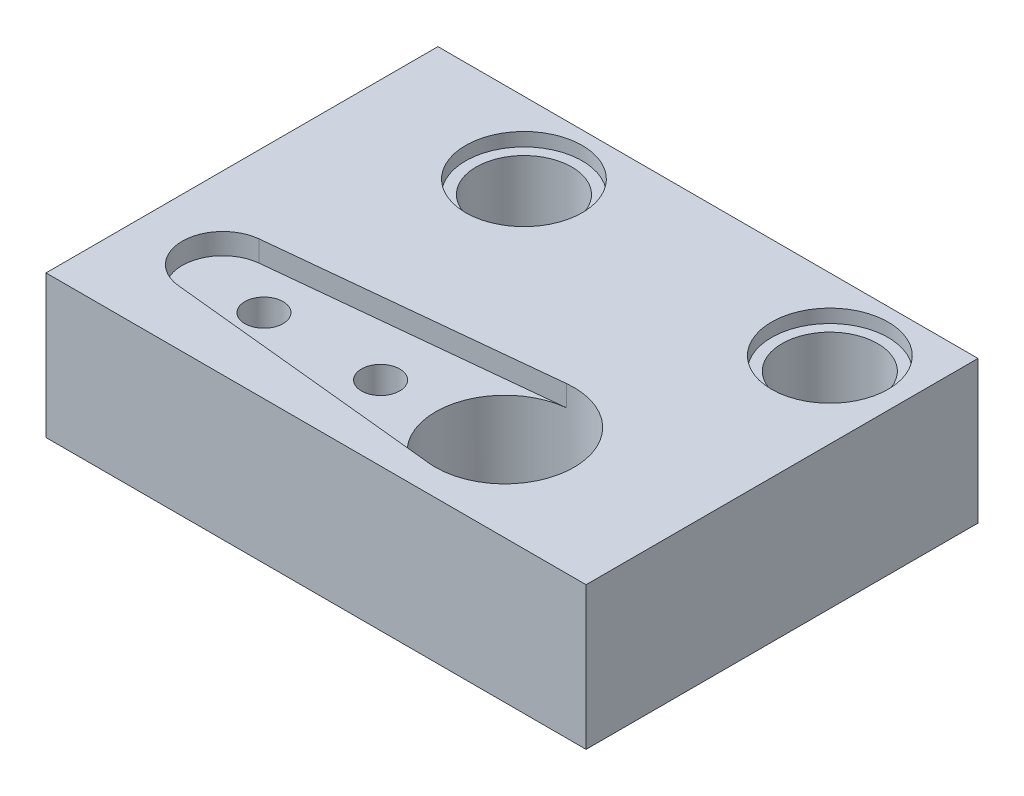
ISO-10303-21;
HEADER;
FILE_DESCRIPTION(('STEP AP214'),'2;1');
FILE_NAME('part.step','',(''),(''),'','','');
FILE_SCHEMA(('AUTOMOTIVE_DESIGN { 1 0 10303 214 1 1 1 1 }'));
ENDSEC;
DATA;
#1=APPLICATION_CONTEXT('core data for automotive mechanical design processes');
#2=APPLICATION_PROTOCOL_DEFINITION('international standard','automotive_design',2000,#1);
#3=PRODUCT_CONTEXT('',#1,'mechanical');
#4=PRODUCT('Part','Part','',(#3));
#5=PRODUCT_RELATED_PRODUCT_CATEGORY('part','',(#4));
#6=PRODUCT_DEFINITION_FORMATION('','',#4);
#7=PRODUCT_DEFINITION_CONTEXT('part definition',#1,'design');
#8=PRODUCT_DEFINITION('design','',#6,#7);
#9=PRODUCT_DEFINITION_SHAPE('','',#8);
#10=(LENGTH_UNIT() NAMED_UNIT(*) SI_UNIT(.MILLI.,.METRE.));
#11=(NAMED_UNIT(*) PLANE_ANGLE_UNIT() SI_UNIT($,.RADIAN.));
#12=(NAMED_UNIT(*) SI_UNIT($,.STERADIAN.) SOLID_ANGLE_UNIT());
#13=UNCERTAINTY_MEASURE_WITH_UNIT(LENGTH_MEASURE(1.E-05),#10,'distance_accuracy_value','');
#14=(GEOMETRIC_REPRESENTATION_CONTEXT(3) GLOBAL_UNCERTAINTY_ASSIGNED_CONTEXT((#13)) GLOBAL_UNIT_ASSIGNED_CONTEXT((#10,
#11,#12)) REPRESENTATION_CONTEXT('',''));
#15=CARTESIAN_POINT('',(0.,0.,0.));
#16=DIRECTION('',(0.,0.,1.));
#17=DIRECTION('',(1.,0.,0.));
#18=AXIS2_PLACEMENT_3D('',#15,#16,#17);
#19=CARTESIAN_POINT('',(-10.75,7.46,-11.75));
#20=DIRECTION('',(0.,-1.,0.));
#21=DIRECTION('',(0.,0.,-1.));
#22=AXIS2_PLACEMENT_3D('',#19,#20,#21);
#23=CYLINDRICAL_SURFACE('',#22,2.5);
#24=CARTESIAN_POINT('',(-10.75,6.76,-11.75));
#25=DIRECTION('',(0.,1.,0.));
#26=DIRECTION('',(0.,0.,1.));
#27=AXIS2_PLACEMENT_3D('',#24,#25,#26);
#28=CIRCLE('',#27,2.5);
#29=CARTESIAN_POINT('',(-10.75,6.76,-14.25));
#30=VERTEX_POINT('',#29);
#31=EDGE_CURVE('E120',#30,#30,#28,.T.);
#32=CARTESIAN_POINT('',(-10.75,0.7,-11.75));
#33=DIRECTION('',(0.,-1.,0.));
#34=DIRECTION('',(0.,0.,-1.));
#35=AXIS2_PLACEMENT_3D('',#32,#33,#34);
#36=CIRCLE('',#35,2.5);
#37=CARTESIAN_POINT('',(-10.75,0.7,-14.25));
#38=VERTEX_POINT('',#37);
#39=EDGE_CURVE('E36',#38,#38,#36,.T.);
#40=CARTESIAN_POINT('',(-10.75,6.76,-14.25));
#41=CARTESIAN_POINT('',(-10.75,6.696875,-14.25));
#42=CARTESIAN_POINT('',(-10.75,6.63375,-14.25));
#43=CARTESIAN_POINT('',(-10.75,6.5075,-14.25));
#44=CARTESIAN_POINT('',(-10.75,6.444375,-14.25));
#45=CARTESIAN_POINT('',(-10.75,6.318125,-14.25));
#46=CARTESIAN_POINT('',(-10.75,6.255,-14.25));
#47=CARTESIAN_POINT('',(-10.75,6.12875,-14.25));
#48=CARTESIAN_POINT('',(-10.75,6.065625,-14.25));
#49=CARTESIAN_POINT('',(-10.75,5.939375,-14.25));
#50=CARTESIAN_POINT('',(-10.75,5.87625,-14.25));
#51=CARTESIAN_POINT('',(-10.75,5.75,-14.25));
#52=CARTESIAN_POINT('',(-10.75,5.686875,-14.25));
#53=CARTESIAN_POINT('',(-10.75,5.560625,-14.25));
#54=CARTESIAN_POINT('',(-10.75,5.4975,-14.25));
#55=CARTESIAN_POINT('',(-10.75,5.37125,-14.25));
#56=CARTESIAN_POINT('',(-10.75,5.308125,-14.25));
#57=CARTESIAN_POINT('',(-10.75,5.181875,-14.25));
#58=CARTESIAN_POINT('',(-10.75,5.11875,-14.25));
#59=CARTESIAN_POINT('',(-10.75,4.9925,-14.25));
#60=CARTESIAN_POINT('',(-10.75,4.929375,-14.25));
#61=CARTESIAN_POINT('',(-10.75,4.803125,-14.25));
#62=CARTESIAN_POINT('',(-10.75,4.74,-14.25));
#63=CARTESIAN_POINT('',(-10.75,4.61375,-14.25));
#64=CARTESIAN_POINT('',(-10.75,4.550625,-14.25));
#65=CARTESIAN_POINT('',(-10.75,4.424375,-14.25));
#66=CARTESIAN_POINT('',(-10.75,4.36125,-14.25));
#67=CARTESIAN_POINT('',(-10.75,4.235,-14.25));
#68=CARTESIAN_POINT('',(-10.75,4.171875,-14.25));
#69=CARTESIAN_POINT('',(-10.75,4.045625,-14.25));
#70=CARTESIAN_POINT('',(-10.75,3.9825,-14.25));
#71=CARTESIAN_POINT('',(-10.75,3.85625,-14.25));
#72=CARTESIAN_POINT('',(-10.75,3.793125,-14.25));
#73=CARTESIAN_POINT('',(-10.75,3.666875,-14.25));
#74=CARTESIAN_POINT('',(-10.75,3.60375,-14.25));
#75=CARTESIAN_POINT('',(-10.75,3.4775,-14.25));
#76=CARTESIAN_POINT('',(-10.75,3.414375,-14.25));
#77=CARTESIAN_POINT('',(-10.75,3.288125,-14.25));
#78=CARTESIAN_POINT('',(-10.75,3.225,-14.25));
#79=CARTESIAN_POINT('',(-10.75,3.09875,-14.25));
#80=CARTESIAN_POINT('',(-10.75,3.035625,-14.25));
#81=CARTESIAN_POINT('',(-10.75,2.909375,-14.25));
#82=CARTESIAN_POINT('',(-10.75,2.84625,-14.25));
#83=CARTESIAN_POINT('',(-10.75,2.72,-14.25));
#84=CARTESIAN_POINT('',(-10.75,2.656875,-14.25));
#85=CARTESIAN_POINT('',(-10.75,2.530625,-14.25));
#86=CARTESIAN_POINT('',(-10.75,2.4675,-14.25));
#87=CARTESIAN_POINT('',(-10.75,2.34125,-14.25));
#88=CARTESIAN_POINT('',(-10.75,2.278125,-14.25));
#89=CARTESIAN_POINT('',(-10.75,2.151875,-14.25));
#90=CARTESIAN_POINT('',(-10.75,2.08875,-14.25));
#91=CARTESIAN_POINT('',(-10.75,1.9625,-14.25));
#92=CARTESIAN_POINT('',(-10.75,1.899375,-14.25));
#93=CARTESIAN_POINT('',(-10.75,1.773125,-14.25));
#94=CARTESIAN_POINT('',(-10.75,1.71,-14.25));
#95=CARTESIAN_POINT('',(-10.75,1.58375,-14.25));
#96=CARTESIAN_POINT('',(-10.75,1.520625,-14.25));
#97=CARTESIAN_POINT('',(-10.75,1.394375,-14.25));
#98=CARTESIAN_POINT('',(-10.75,1.33125,-14.25));
#99=CARTESIAN_POINT('',(-10.75,1.205,-14.25));
#100=CARTESIAN_POINT('',(-10.75,1.141875,-14.25));
#101=CARTESIAN_POINT('',(-10.75,1.015625,-14.25));
#102=CARTESIAN_POINT('',(-10.75,0.952500000000001,-14.25));
#103=CARTESIAN_POINT('',(-10.75,0.82625,-14.25));
#104=CARTESIAN_POINT('',(-10.75,0.763125,-14.25));
#105=CARTESIAN_POINT('',(-10.75,0.7,-14.25));
#106=B_SPLINE_CURVE_WITH_KNOTS('',3,(#40,#41,#42,#43,#44,#45,#46,#47,#48,#49,#50,#51,#52,#53,
#54,#55,#56,#57,#58,#59,#60,#61,#62,#63,#64,#65,#66,#67,#68,#69,#70,#71,#72,#73,#74,#75,#76,#77,
#78,#79,#80,#81,#82,#83,#84,#85,#86,#87,#88,#89,#90,#91,#92,#93,#94,#95,#96,#97,#98,#99,#100,
#101,#102,#103,#104,#105),.UNSPECIFIED.,.F.,.F.,(4,2,2,2,2,2,2,2,2,2,2,2,2,2,2,2,2,2,2,2,2,2,2,
2,2,2,2,2,2,2,2,2,4),(0.,0.189375,0.37875,0.568125,0.7575,0.946875,1.13625,1.325625,1.515,
1.704375,1.89375,2.083125,2.2725,2.461875,2.65125,2.840625,3.03,3.219375,3.40875,3.598125,
3.7875,3.976875,4.16625,4.355625,4.545,4.734375,4.92375,5.113125,5.3025,5.491875,5.68125,
5.870625,6.06),.UNSPECIFIED.);
#107=EDGE_CURVE('BSEAM32',#30,#38,#106,.T.);
#108=ORIENTED_EDGE('',*,*,#31,.T.);
#109=ORIENTED_EDGE('',*,*,#39,.T.);
#110=ORIENTED_EDGE('',*,*,#107,.T.);
#111=ORIENTED_EDGE('',*,*,#107,.F.);
#112=EDGE_LOOP('',(#108,#110,#109,#111));
#113=FACE_BOUND('',#112,.T.);
#114=ADVANCED_FACE('F32',(#113),#23,.F.);
#115=CARTESIAN_POINT('',(5.25,7.46,-11.75));
#116=DIRECTION('',(0.,-1.,0.));
#117=DIRECTION('',(0.,0.,-1.));
#118=AXIS2_PLACEMENT_3D('',#115,#116,#117);
#119=CYLINDRICAL_SURFACE('',#118,2.5);
#120=CARTESIAN_POINT('',(5.25,6.76,-11.75));
#121=DIRECTION('',(0.,1.,0.));
#122=DIRECTION('',(0.,0.,1.));
#123=AXIS2_PLACEMENT_3D('',#120,#121,#122);
#124=CIRCLE('',#123,2.5);
#125=CARTESIAN_POINT('',(5.25,6.76,-14.25));
#126=VERTEX_POINT('',#125);
#127=EDGE_CURVE('E176',#126,#126,#124,.T.);
#128=CARTESIAN_POINT('',(5.25,0.7,-11.75));
#129=DIRECTION('',(0.,-1.,0.));
#130=DIRECTION('',(0.,0.,-1.));
#131=AXIS2_PLACEMENT_3D('',#128,#129,#130);
#132=CIRCLE('',#131,2.5);
#133=CARTESIAN_POINT('',(5.25,0.7,-14.25));
#134=VERTEX_POINT('',#133);
#135=EDGE_CURVE('E180',#134,#134,#132,.T.);
#136=CARTESIAN_POINT('',(5.25,6.76,-14.25));
#137=CARTESIAN_POINT('',(5.25,6.696875,-14.25));
#138=CARTESIAN_POINT('',(5.25,6.63375,-14.25));
#139=CARTESIAN_POINT('',(5.25,6.5075,-14.25));
#140=CARTESIAN_POINT('',(5.25,6.444375,-14.25));
#141=CARTESIAN_POINT('',(5.25,6.318125,-14.25));
#142=CARTESIAN_POINT('',(5.25,6.255,-14.25));
#143=CARTESIAN_POINT('',(5.25,6.12875,-14.25));
#144=CARTESIAN_POINT('',(5.25,6.065625,-14.25));
#145=CARTESIAN_POINT('',(5.25,5.939375,-14.25));
#146=CARTESIAN_POINT('',(5.25,5.87625,-14.25));
#147=CARTESIAN_POINT('',(5.25,5.75,-14.25));
#148=CARTESIAN_POINT('',(5.25,5.686875,-14.25));
#149=CARTESIAN_POINT('',(5.25,5.560625,-14.25));
#150=CARTESIAN_POINT('',(5.25,5.4975,-14.25));
#151=CARTESIAN_POINT('',(5.25,5.37125,-14.25));
#152=CARTESIAN_POINT('',(5.25,5.308125,-14.25));
#153=CARTESIAN_POINT('',(5.25,5.181875,-14.25));
#154=CARTESIAN_POINT('',(5.25,5.11875,-14.25));
#155=CARTESIAN_POINT('',(5.25,4.9925,-14.25));
#156=CARTESIAN_POINT('',(5.25,4.929375,-14.25));
#157=CARTESIAN_POINT('',(5.25,4.803125,-14.25));
#158=CARTESIAN_POINT('',(5.25,4.74,-14.25));
#159=CARTESIAN_POINT('',(5.25,4.61375,-14.25));
#160=CARTESIAN_POINT('',(5.25,4.550625,-14.25));
#161=CARTESIAN_POINT('',(5.25,4.424375,-14.25));
#162=CARTESIAN_POINT('',(5.25,4.36125,-14.25));
#163=CARTESIAN_POINT('',(5.25,4.235,-14.25));
#164=CARTESIAN_POINT('',(5.25,4.171875,-14.25));
#165=CARTESIAN_POINT('',(5.25,4.045625,-14.25));
#166=CARTESIAN_POINT('',(5.25,3.9825,-14.25));
#167=CARTESIAN_POINT('',(5.25,3.85625,-14.25));
#168=CARTESIAN_POINT('',(5.25,3.793125,-14.25));
#169=CARTESIAN_POINT('',(5.25,3.666875,-14.25));
#170=CARTESIAN_POINT('',(5.25,3.60375,-14.25));
#171=CARTESIAN_POINT('',(5.25,3.4775,-14.25));
#172=CARTESIAN_POINT('',(5.25,3.414375,-14.25));
#173=CARTESIAN_POINT('',(5.25,3.288125,-14.25));
#174=CARTESIAN_POINT('',(5.25,3.225,-14.25));
#175=CARTESIAN_POINT('',(5.25,3.09875,-14.25));
#176=CARTESIAN_POINT('',(5.25,3.035625,-14.25));
#177=CARTESIAN_POINT('',(5.25,2.909375,-14.25));
#178=CARTESIAN_POINT('',(5.25,2.84625,-14.25));
#179=CARTESIAN_POINT('',(5.25,2.72,-14.25));
#180=CARTESIAN_POINT('',(5.25,2.656875,-14.25));
#181=CARTESIAN_POINT('',(5.25,2.530625,-14.25));
#182=CARTESIAN_POINT('',(5.25,2.4675,-14.25));
#183=CARTESIAN_POINT('',(5.25,2.34125,-14.25));
#184=CARTESIAN_POINT('',(5.25,2.278125,-14.25));
#185=CARTESIAN_POINT('',(5.25,2.151875,-14.25));
#186=CARTESIAN_POINT('',(5.25,2.08875,-14.25));
#187=CARTESIAN_POINT('',(5.25,1.9625,-14.25));
#188=CARTESIAN_POINT('',(5.25,1.899375,-14.25));
#189=CARTESIAN_POINT('',(5.25,1.773125,-14.25));
#190=CARTESIAN_POINT('',(5.25,1.71,-14.25));
#191=CARTESIAN_POINT('',(5.25,1.58375,-14.25));
#192=CARTESIAN_POINT('',(5.25,1.520625,-14.25));
#193=CARTESIAN_POINT('',(5.25,1.394375,-14.25));
#194=CARTESIAN_POINT('',(5.25,1.33125,-14.25));
#195=CARTESIAN_POINT('',(5.25,1.205,-14.25));
#196=CARTESIAN_POINT('',(5.25,1.141875,-14.25));
#197=CARTESIAN_POINT('',(5.25,1.015625,-14.25));
#198=CARTESIAN_POINT('',(5.25,0.952500000000001,-14.25));
#199=CARTESIAN_POINT('',(5.25,0.82625,-14.25));
#200=CARTESIAN_POINT('',(5.25,0.763125,-14.25));
#201=CARTESIAN_POINT('',(5.25,0.7,-14.25));
#202=B_SPLINE_CURVE_WITH_KNOTS('',3,(#136,#137,#138,#139,#140,#141,#142,#143,#144,#145,#146,
#147,#148,#149,#150,#151,#152,#153,#154,#155,#156,#157,#158,#159,#160,#161,#162,#163,#164,#165,
#166,#167,#168,#169,#170,#171,#172,#173,#174,#175,#176,#177,#178,#179,#180,#181,#182,#183,#184,
#185,#186,#187,#188,#189,#190,#191,#192,#193,#194,#195,#196,#197,#198,#199,#200,#201),
.UNSPECIFIED.,.F.,.F.,(4,2,2,2,2,2,2,2,2,2,2,2,2,2,2,2,2,2,2,2,2,2,2,2,2,2,2,2,2,2,2,2,4),(0.,
0.189375,0.37875,0.568125,0.7575,0.946875,1.13625,1.325625,1.515,1.704375,1.89375,2.083125,
2.2725,2.461875,2.65125,2.840625,3.03,3.219375,3.40875,3.598125,3.7875,3.976875,4.16625,
4.355625,4.545,4.734375,4.92375,5.113125,5.3025,5.491875,5.68125,5.870625,6.06),.UNSPECIFIED.);
#203=EDGE_CURVE('BSEAM225',#126,#134,#202,.T.);
#204=ORIENTED_EDGE('',*,*,#127,.T.);
#205=ORIENTED_EDGE('',*,*,#135,.T.);
#206=ORIENTED_EDGE('',*,*,#203,.T.);
#207=ORIENTED_EDGE('',*,*,#203,.F.);
#208=EDGE_LOOP('',(#204,#206,#205,#207));
#209=FACE_BOUND('',#208,.T.);
#210=ADVANCED_FACE('F225',(#209),#119,.F.);
#211=CARTESIAN_POINT('',(0.,7.46,0.));
#212=DIRECTION('',(0.,1.,0.));
#213=DIRECTION('',(0.,0.,1.));
#214=AXIS2_PLACEMENT_3D('',#211,#212,#213);
#215=PLANE('',#214);
#216=CARTESIAN_POINT('',(5.25,7.46,-11.75));
#217=DIRECTION('',(0.,1.,0.));
#218=DIRECTION('',(0.,0.,1.));
#219=AXIS2_PLACEMENT_3D('',#216,#217,#218);
#220=CIRCLE('',#219,3.05);
#221=CARTESIAN_POINT('',(5.25,7.46,-8.69999999999999));
#222=VERTEX_POINT('',#221);
#223=EDGE_CURVE('E182',#222,#222,#220,.T.);
#224=ORIENTED_EDGE('',*,*,#223,.F.);
#225=EDGE_LOOP('',(#224));
#226=FACE_BOUND('',#225,.T.);
#227=CARTESIAN_POINT('',(-10.75,7.46,-11.75));
#228=DIRECTION('',(0.,1.,0.));
#229=DIRECTION('',(0.,0.,1.));
#230=AXIS2_PLACEMENT_3D('',#227,#228,#229);
#231=CIRCLE('',#230,3.05);
#232=CARTESIAN_POINT('',(-10.75,7.46,-8.7));
#233=VERTEX_POINT('',#232);
#234=EDGE_CURVE('E178',#233,#233,#231,.T.);
#235=ORIENTED_EDGE('',*,*,#234,.F.);
#236=EDGE_LOOP('',(#235));
#237=FACE_BOUND('',#236,.T.);
#238=CARTESIAN_POINT('',(-14.75,7.46,0.));
#239=DIRECTION('',(0.,1.,0.));
#240=DIRECTION('',(0.,0.,1.));
#241=AXIS2_PLACEMENT_3D('',#238,#239,#240);
#242=CIRCLE('',#241,2.125);
#243=CARTESIAN_POINT('',(-14.9654595343537,7.46,-2.11404876695314));
#244=VERTEX_POINT('',#243);
#245=CARTESIAN_POINT('',(-14.9654595343537,7.46,2.11404876695314));
#246=VERTEX_POINT('',#245);
#247=EDGE_CURVE('E49',#244,#246,#242,.T.);
#248=ORIENTED_EDGE('',*,*,#247,.F.);
#249=DIRECTION('',(-0.994846478566184,0.,0.101392722048793));
#250=VECTOR('',#249,1.);
#251=CARTESIAN_POINT('',(-14.9654595343537,7.46,-2.11404876695314));
#252=LINE('',#251,#250);
#253=CARTESIAN_POINT('',(-0.367096674599524,7.46,-3.60188410606974));
#254=VERTEX_POINT('',#253);
#255=EDGE_CURVE('E149',#254,#244,#252,.T.);
#256=ORIENTED_EDGE('',*,*,#255,.F.);
#257=CARTESIAN_POINT('',(0.,7.46,0.));
#258=DIRECTION('',(0.,1.,0.));
#259=DIRECTION('',(0.,0.,1.));
#260=AXIS2_PLACEMENT_3D('',#257,#258,#259);
#261=CIRCLE('',#260,3.62054265021969);
#262=CARTESIAN_POINT('',(-0.367096674599523,7.46,3.60188410606974));
#263=VERTEX_POINT('',#262);
#264=EDGE_CURVE('E127',#263,#254,#261,.T.);
#265=ORIENTED_EDGE('',*,*,#264,.F.);
#266=DIRECTION('',(0.994846478566184,0.,0.101392722048792));
#267=VECTOR('',#266,1.);
#268=CARTESIAN_POINT('',(-14.9654595343537,7.46,2.11404876695314));
#269=LINE('',#268,#267);
#270=EDGE_CURVE('E144',#246,#263,#269,.T.);
#271=ORIENTED_EDGE('',*,*,#270,.F.);
#272=EDGE_LOOP('',(#248,#256,#265,#271));
#273=FACE_BOUND('',#272,.T.);
#274=DIRECTION('',(0.,0.,-1.));
#275=VECTOR('',#274,1.);
#276=CARTESIAN_POINT('',(9.25,7.46,-15.5));
#277=LINE('',#276,#275);
#278=CARTESIAN_POINT('',(9.25000000000001,7.46,5.));
#279=VERTEX_POINT('',#278);
#280=CARTESIAN_POINT('',(9.25,7.46,-15.5));
#281=VERTEX_POINT('',#280);
#282=EDGE_CURVE('E154',#279,#281,#277,.T.);
#283=ORIENTED_EDGE('',*,*,#282,.T.);
#284=DIRECTION('',(-1.,0.,0.));
#285=VECTOR('',#284,1.);
#286=CARTESIAN_POINT('',(9.25,7.46,-15.5));
#287=LINE('',#286,#285);
#288=CARTESIAN_POINT('',(-19.,7.46,-15.5));
#289=VERTEX_POINT('',#288);
#290=EDGE_CURVE('E86',#281,#289,#287,.T.);
#291=ORIENTED_EDGE('',*,*,#290,.T.);
#292=DIRECTION('',(0.,0.,1.));
#293=VECTOR('',#292,1.);
#294=CARTESIAN_POINT('',(-19.,7.46,-15.5));
#295=LINE('',#294,#293);
#296=CARTESIAN_POINT('',(-19.,7.46,5.));
#297=VERTEX_POINT('',#296);
#298=EDGE_CURVE('E157',#289,#297,#295,.T.);
#299=ORIENTED_EDGE('',*,*,#298,.T.);
#300=DIRECTION('',(1.,0.,0.));
#301=VECTOR('',#300,1.);
#302=CARTESIAN_POINT('',(-19.,7.46,5.));
#303=LINE('',#302,#301);
#304=EDGE_CURVE('E58',#297,#279,#303,.T.);
#305=ORIENTED_EDGE('',*,*,#304,.T.);
#306=EDGE_LOOP('',(#283,#291,#299,#305));
#307=FACE_BOUND('',#306,.T.);
#308=ADVANCED_FACE('F222',(#226,#237,#273,#307),#215,.T.);
#309=CARTESIAN_POINT('',(0.,0.,0.));
#310=DIRECTION('',(0.,1.,0.));
#311=DIRECTION('',(0.,0.,1.));
#312=AXIS2_PLACEMENT_3D('',#309,#310,#311);
#313=PLANE('',#312);
#314=CARTESIAN_POINT('',(-10.75,0.,-11.75));
#315=DIRECTION('',(0.,-1.,0.));
#316=DIRECTION('',(0.,0.,-1.));
#317=AXIS2_PLACEMENT_3D('',#314,#315,#316);
#318=CIRCLE('',#317,3.05);
#319=CARTESIAN_POINT('',(-10.75,0.,-14.8));
#320=VERTEX_POINT('',#319);
#321=EDGE_CURVE('E196',#320,#320,#318,.T.);
#322=ORIENTED_EDGE('',*,*,#321,.F.);
#323=EDGE_LOOP('',(#322));
#324=FACE_BOUND('',#323,.T.);
#325=CARTESIAN_POINT('',(5.25,0.,-11.75));
#326=DIRECTION('',(0.,-1.,0.));
#327=DIRECTION('',(0.,0.,-1.));
#328=AXIS2_PLACEMENT_3D('',#325,#326,#327);
#329=CIRCLE('',#328,3.05);
#330=CARTESIAN_POINT('',(5.25,0.,-14.8));
#331=VERTEX_POINT('',#330);
#332=EDGE_CURVE('E189',#331,#331,#329,.T.);
#333=ORIENTED_EDGE('',*,*,#332,.F.);
#334=EDGE_LOOP('',(#333));
#335=FACE_BOUND('',#334,.T.);
#336=CARTESIAN_POINT('',(-6.5,0.,0.));
#337=DIRECTION('',(0.,1.,0.));
#338=DIRECTION('',(0.,0.,1.));
#339=AXIS2_PLACEMENT_3D('',#336,#337,#338);
#340=CIRCLE('',#339,1.);
#341=CARTESIAN_POINT('',(-6.5,0.,1.));
#342=VERTEX_POINT('',#341);
#343=EDGE_CURVE('E205',#342,#342,#340,.T.);
#344=ORIENTED_EDGE('',*,*,#343,.T.);
#345=EDGE_LOOP('',(#344));
#346=FACE_BOUND('',#345,.T.);
#347=CARTESIAN_POINT('',(0.,0.,0.));
#348=DIRECTION('',(0.,1.,0.));
#349=DIRECTION('',(0.,0.,1.));
#350=AXIS2_PLACEMENT_3D('',#347,#348,#349);
#351=CIRCLE('',#350,3.62054265021969);
#352=CARTESIAN_POINT('',(0.,0.,3.62054265021969));
#353=VERTEX_POINT('',#352);
#354=EDGE_CURVE('E119',#353,#353,#351,.T.);
#355=ORIENTED_EDGE('',*,*,#354,.T.);
#356=EDGE_LOOP('',(#355));
#357=FACE_BOUND('',#356,.T.);
#358=CARTESIAN_POINT('',(-12.6,0.,0.));
#359=DIRECTION('',(0.,1.,0.));
#360=DIRECTION('',(0.,0.,1.));
#361=AXIS2_PLACEMENT_3D('',#358,#359,#360);
#362=CIRCLE('',#361,1.);
#363=CARTESIAN_POINT('',(-12.6,0.,1.));
#364=VERTEX_POINT('',#363);
#365=EDGE_CURVE('E145',#364,#364,#362,.T.);
#366=ORIENTED_EDGE('',*,*,#365,.T.);
#367=EDGE_LOOP('',(#366));
#368=FACE_BOUND('',#367,.T.);
#369=DIRECTION('',(0.,0.,-1.));
#370=VECTOR('',#369,1.);
#371=CARTESIAN_POINT('',(9.25,0.,-15.5));
#372=LINE('',#371,#370);
#373=CARTESIAN_POINT('',(9.25000000000001,0.,5.));
#374=VERTEX_POINT('',#373);
#375=CARTESIAN_POINT('',(9.25,0.,-15.5));
#376=VERTEX_POINT('',#375);
#377=EDGE_CURVE('E151',#374,#376,#372,.T.);
#378=ORIENTED_EDGE('',*,*,#377,.F.);
#379=DIRECTION('',(1.,0.,0.));
#380=VECTOR('',#379,1.);
#381=CARTESIAN_POINT('',(-19.,0.,5.));
#382=LINE('',#381,#380);
#383=CARTESIAN_POINT('',(-19.,0.,5.));
#384=VERTEX_POINT('',#383);
#385=EDGE_CURVE('E79',#384,#374,#382,.T.);
#386=ORIENTED_EDGE('',*,*,#385,.F.);
#387=DIRECTION('',(0.,0.,1.));
#388=VECTOR('',#387,1.);
#389=CARTESIAN_POINT('',(-19.,0.,-15.5));
#390=LINE('',#389,#388);
#391=CARTESIAN_POINT('',(-19.,0.,-15.5));
#392=VERTEX_POINT('',#391);
#393=EDGE_CURVE('E165',#392,#384,#390,.T.);
#394=ORIENTED_EDGE('',*,*,#393,.F.);
#395=DIRECTION('',(-1.,0.,0.));
#396=VECTOR('',#395,1.);
#397=CARTESIAN_POINT('',(9.25,0.,-15.5));
#398=LINE('',#397,#396);
#399=EDGE_CURVE('E163',#376,#392,#398,.T.);
#400=ORIENTED_EDGE('',*,*,#399,.F.);
#401=EDGE_LOOP('',(#378,#386,#394,#400));
#402=FACE_BOUND('',#401,.T.);
#403=ADVANCED_FACE('F224',(#324,#335,#346,#357,#368,#402),#313,.F.);
#404=CARTESIAN_POINT('',(9.25,7.46,-15.5));
#405=DIRECTION('',(-1.,0.,0.));
#406=DIRECTION('',(0.,0.,1.));
#407=AXIS2_PLACEMENT_3D('',#404,#405,#406);
#408=PLANE('',#407);
#409=ORIENTED_EDGE('',*,*,#377,.T.);
#410=DIRECTION('',(0.,-1.,0.));
#411=VECTOR('',#410,1.);
#412=CARTESIAN_POINT('',(9.25,7.46,-15.5));
#413=LINE('',#412,#411);
#414=EDGE_CURVE('E11',#281,#376,#413,.T.);
#415=ORIENTED_EDGE('',*,*,#414,.F.);
#416=ORIENTED_EDGE('',*,*,#282,.F.);
#417=DIRECTION('',(0.,-1.,0.));
#418=VECTOR('',#417,1.);
#419=CARTESIAN_POINT('',(9.25000000000001,7.46,5.));
#420=LINE('',#419,#418);
#421=EDGE_CURVE('E160',#279,#374,#420,.T.);
#422=ORIENTED_EDGE('',*,*,#421,.T.);
#423=EDGE_LOOP('',(#409,#415,#416,#422));
#424=FACE_BOUND('',#423,.T.);
#425=ADVANCED_FACE('F34',(#424),#408,.F.);
#426=CARTESIAN_POINT('',(9.25,7.46,-15.5));
#427=DIRECTION('',(0.,0.,1.));
#428=DIRECTION('',(1.,0.,0.));
#429=AXIS2_PLACEMENT_3D('',#426,#427,#428);
#430=PLANE('',#429);
#431=ORIENTED_EDGE('',*,*,#399,.T.);
#432=DIRECTION('',(0.,-1.,0.));
#433=VECTOR('',#432,1.);
#434=CARTESIAN_POINT('',(-19.,7.46,-15.5));
#435=LINE('',#434,#433);
#436=EDGE_CURVE('E41',#289,#392,#435,.T.);
#437=ORIENTED_EDGE('',*,*,#436,.F.);
#438=ORIENTED_EDGE('',*,*,#290,.F.);
#439=ORIENTED_EDGE('',*,*,#414,.T.);
#440=EDGE_LOOP('',(#431,#437,#438,#439));
#441=FACE_BOUND('',#440,.T.);
#442=ADVANCED_FACE('F232',(#441),#430,.F.);
#443=CARTESIAN_POINT('',(-19.,7.46,-15.5));
#444=DIRECTION('',(1.,0.,0.));
#445=DIRECTION('',(0.,0.,-1.));
#446=AXIS2_PLACEMENT_3D('',#443,#444,#445);
#447=PLANE('',#446);
#448=ORIENTED_EDGE('',*,*,#393,.T.);
#449=DIRECTION('',(0.,-1.,0.));
#450=VECTOR('',#449,1.);
#451=CARTESIAN_POINT('',(-19.,7.46,5.));
#452=LINE('',#451,#450);
#453=EDGE_CURVE('E169',#297,#384,#452,.T.);
#454=ORIENTED_EDGE('',*,*,#453,.F.);
#455=ORIENTED_EDGE('',*,*,#298,.F.);
#456=ORIENTED_EDGE('',*,*,#436,.T.);
#457=EDGE_LOOP('',(#448,#454,#455,#456));
#458=FACE_BOUND('',#457,.T.);
#459=ADVANCED_FACE('F237',(#458),#447,.F.);
#460=CARTESIAN_POINT('',(-19.,7.46,5.));
#461=DIRECTION('',(0.,0.,-1.));
#462=DIRECTION('',(-1.,0.,0.));
#463=AXIS2_PLACEMENT_3D('',#460,#461,#462);
#464=PLANE('',#463);
#465=ORIENTED_EDGE('',*,*,#385,.T.);
#466=ORIENTED_EDGE('',*,*,#421,.F.);
#467=ORIENTED_EDGE('',*,*,#304,.F.);
#468=ORIENTED_EDGE('',*,*,#453,.T.);
#469=EDGE_LOOP('',(#465,#466,#467,#468));
#470=FACE_BOUND('',#469,.T.);
#471=ADVANCED_FACE('F260',(#470),#464,.F.);
#472=CARTESIAN_POINT('',(-14.75,6.36,0.));
#473=DIRECTION('',(0.,1.,0.));
#474=DIRECTION('',(0.,0.,1.));
#475=AXIS2_PLACEMENT_3D('',#472,#473,#474);
#476=CYLINDRICAL_SURFACE('',#475,2.125);
#477=ORIENTED_EDGE('',*,*,#247,.T.);
#478=DIRECTION('',(0.,1.,0.));
#479=VECTOR('',#478,1.);
#480=CARTESIAN_POINT('',(-14.9654595343537,6.36,2.11404876695314));
#481=LINE('',#480,#479);
#482=CARTESIAN_POINT('',(-14.9654595343537,6.36,2.11404876695314));
#483=VERTEX_POINT('',#482);
#484=EDGE_CURVE('E136',#483,#246,#481,.T.);
#485=ORIENTED_EDGE('',*,*,#484,.F.);
#486=CARTESIAN_POINT('',(-14.75,6.36,0.));
#487=DIRECTION('',(0.,1.,0.));
#488=DIRECTION('',(0.,0.,1.));
#489=AXIS2_PLACEMENT_3D('',#486,#487,#488);
#490=CIRCLE('',#489,2.125);
#491=CARTESIAN_POINT('',(-14.9654595343537,6.36,-2.11404876695314));
#492=VERTEX_POINT('',#491);
#493=EDGE_CURVE('E139',#492,#483,#490,.T.);
#494=ORIENTED_EDGE('',*,*,#493,.F.);
#495=DIRECTION('',(0.,1.,0.));
#496=VECTOR('',#495,1.);
#497=CARTESIAN_POINT('',(-14.9654595343537,6.36,-2.11404876695314));
#498=LINE('',#497,#496);
#499=EDGE_CURVE('E131',#492,#244,#498,.T.);
#500=ORIENTED_EDGE('',*,*,#499,.T.);
#501=EDGE_LOOP('',(#477,#485,#494,#500));
#502=FACE_BOUND('',#501,.T.);
#503=ADVANCED_FACE('F217',(#502),#476,.F.);
#504=CARTESIAN_POINT('',(-14.9654595343537,6.36,-2.11404876695314));
#505=DIRECTION('',(-0.101392722048793,0.,-0.994846478566184));
#506=DIRECTION('',(-0.994846478566184,0.,0.101392722048793));
#507=AXIS2_PLACEMENT_3D('',#504,#505,#506);
#508=PLANE('',#507);
#509=ORIENTED_EDGE('',*,*,#255,.T.);
#510=ORIENTED_EDGE('',*,*,#499,.F.);
#511=DIRECTION('',(-0.994846478566184,0.,0.101392722048793));
#512=VECTOR('',#511,1.);
#513=CARTESIAN_POINT('',(-14.9654595343537,6.36,-2.11404876695314));
#514=LINE('',#513,#512);
#515=CARTESIAN_POINT('',(-0.367096674599524,6.36,-3.60188410606974));
#516=VERTEX_POINT('',#515);
#517=EDGE_CURVE('E114',#516,#492,#514,.T.);
#518=ORIENTED_EDGE('',*,*,#517,.F.);
#519=DIRECTION('',(0.,1.,0.));
#520=VECTOR('',#519,1.);
#521=CARTESIAN_POINT('',(-0.367096674599524,6.36,-3.60188410606974));
#522=LINE('',#521,#520);
#523=EDGE_CURVE('E123',#516,#254,#522,.T.);
#524=ORIENTED_EDGE('',*,*,#523,.T.);
#525=EDGE_LOOP('',(#509,#510,#518,#524));
#526=FACE_BOUND('',#525,.T.);
#527=ADVANCED_FACE('F134',(#526),#508,.F.);
#528=CARTESIAN_POINT('',(0.,6.36,0.));
#529=DIRECTION('',(0.,1.,0.));
#530=DIRECTION('',(0.,0.,1.));
#531=AXIS2_PLACEMENT_3D('',#528,#529,#530);
#532=CYLINDRICAL_SURFACE('',#531,3.62054265021969);
#533=ORIENTED_EDGE('',*,*,#264,.T.);
#534=ORIENTED_EDGE('',*,*,#523,.F.);
#535=CARTESIAN_POINT('',(0.,6.36,0.));
#536=DIRECTION('',(0.,1.,0.));
#537=DIRECTION('',(0.,0.,1.));
#538=AXIS2_PLACEMENT_3D('',#535,#536,#537);
#539=CIRCLE('',#538,3.62054265021969);
#540=CARTESIAN_POINT('',(-0.367096674599523,6.36,3.60188410606974));
#541=VERTEX_POINT('',#540);
#542=EDGE_CURVE('E108',#516,#541,#539,.T.);
#543=ORIENTED_EDGE('',*,*,#542,.T.);
#544=DIRECTION('',(0.,1.,0.));
#545=VECTOR('',#544,1.);
#546=CARTESIAN_POINT('',(-0.367096674599523,6.36,3.60188410606974));
#547=LINE('',#546,#545);
#548=EDGE_CURVE('E132',#541,#263,#547,.T.);
#549=ORIENTED_EDGE('',*,*,#548,.T.);
#550=EDGE_LOOP('',(#533,#534,#543,#549));
#551=FACE_BOUND('',#550,.T.);
#552=ORIENTED_EDGE('',*,*,#354,.F.);
#553=EDGE_LOOP('',(#552));
#554=FACE_BOUND('',#553,.T.);
#555=ADVANCED_FACE('F124',(#551,#554),#532,.F.);
#556=CARTESIAN_POINT('',(-14.9654595343537,6.36,2.11404876695314));
#557=DIRECTION('',(-0.101392722048792,0.,0.994846478566184));
#558=DIRECTION('',(0.994846478566184,0.,0.101392722048792));
#559=AXIS2_PLACEMENT_3D('',#556,#557,#558);
#560=PLANE('',#559);
#561=ORIENTED_EDGE('',*,*,#270,.T.);
#562=ORIENTED_EDGE('',*,*,#548,.F.);
#563=DIRECTION('',(0.994846478566184,0.,0.101392722048792));
#564=VECTOR('',#563,1.);
#565=CARTESIAN_POINT('',(-14.9654595343537,6.36,2.11404876695314));
#566=LINE('',#565,#564);
#567=EDGE_CURVE('E116',#483,#541,#566,.T.);
#568=ORIENTED_EDGE('',*,*,#567,.F.);
#569=ORIENTED_EDGE('',*,*,#484,.T.);
#570=EDGE_LOOP('',(#561,#562,#568,#569));
#571=FACE_BOUND('',#570,.T.);
#572=ADVANCED_FACE('F220',(#571),#560,.F.);
#573=CARTESIAN_POINT('',(-14.75,6.36,0.));
#574=DIRECTION('',(0.,1.,0.));
#575=DIRECTION('',(0.,0.,1.));
#576=AXIS2_PLACEMENT_3D('',#573,#574,#575);
#577=PLANE('',#576);
#578=CARTESIAN_POINT('',(-6.5,6.36,0.));
#579=DIRECTION('',(0.,1.,0.));
#580=DIRECTION('',(0.,0.,1.));
#581=AXIS2_PLACEMENT_3D('',#578,#579,#580);
#582=CIRCLE('',#581,1.);
#583=CARTESIAN_POINT('',(-6.5,6.36,1.));
#584=VERTEX_POINT('',#583);
#585=EDGE_CURVE('E209',#584,#584,#582,.T.);
#586=ORIENTED_EDGE('',*,*,#585,.F.);
#587=EDGE_LOOP('',(#586));
#588=FACE_BOUND('',#587,.T.);
#589=ORIENTED_EDGE('',*,*,#542,.F.);
#590=ORIENTED_EDGE('',*,*,#517,.T.);
#591=ORIENTED_EDGE('',*,*,#493,.T.);
#592=ORIENTED_EDGE('',*,*,#567,.T.);
#593=EDGE_LOOP('',(#589,#590,#591,#592));
#594=FACE_BOUND('',#593,.T.);
#595=CARTESIAN_POINT('',(-12.6,6.36,0.));
#596=DIRECTION('',(0.,1.,0.));
#597=DIRECTION('',(0.,0.,1.));
#598=AXIS2_PLACEMENT_3D('',#595,#596,#597);
#599=CIRCLE('',#598,1.);
#600=CARTESIAN_POINT('',(-12.6,6.36,1.));
#601=VERTEX_POINT('',#600);
#602=EDGE_CURVE('E208',#601,#601,#599,.T.);
#603=ORIENTED_EDGE('',*,*,#602,.F.);
#604=EDGE_LOOP('',(#603));
#605=FACE_BOUND('',#604,.T.);
#606=ADVANCED_FACE('F110',(#588,#594,#605),#577,.T.);
#607=CARTESIAN_POINT('',(-12.6,0.,0.));
#608=DIRECTION('',(0.,1.,0.));
#609=DIRECTION('',(0.,0.,1.));
#610=AXIS2_PLACEMENT_3D('',#607,#608,#609);
#611=CYLINDRICAL_SURFACE('',#610,1.);
#612=ORIENTED_EDGE('',*,*,#365,.F.);
#613=EDGE_LOOP('',(#612));
#614=FACE_BOUND('',#613,.T.);
#615=ORIENTED_EDGE('',*,*,#602,.T.);
#616=EDGE_LOOP('',(#615));
#617=FACE_BOUND('',#616,.T.);
#618=ADVANCED_FACE('F269',(#614,#617),#611,.F.);
#619=CARTESIAN_POINT('',(-6.5,0.,0.));
#620=DIRECTION('',(0.,1.,0.));
#621=DIRECTION('',(0.,0.,1.));
#622=AXIS2_PLACEMENT_3D('',#619,#620,#621);
#623=CYLINDRICAL_SURFACE('',#622,1.);
#624=ORIENTED_EDGE('',*,*,#343,.F.);
#625=EDGE_LOOP('',(#624));
#626=FACE_BOUND('',#625,.T.);
#627=ORIENTED_EDGE('',*,*,#585,.T.);
#628=EDGE_LOOP('',(#627));
#629=FACE_BOUND('',#628,.T.);
#630=ADVANCED_FACE('F273',(#626,#629),#623,.F.);
#631=CARTESIAN_POINT('',(-10.75,6.76,-11.75));
#632=DIRECTION('',(0.,1.,0.));
#633=DIRECTION('',(0.,0.,1.));
#634=AXIS2_PLACEMENT_3D('',#631,#632,#633);
#635=CYLINDRICAL_SURFACE('',#634,3.05);
#636=CARTESIAN_POINT('',(-10.75,6.76,-11.75));
#637=DIRECTION('',(0.,1.,0.));
#638=DIRECTION('',(0.,0.,1.));
#639=AXIS2_PLACEMENT_3D('',#636,#637,#638);
#640=CIRCLE('',#639,3.05);
#641=CARTESIAN_POINT('',(-10.75,6.76,-8.7));
#642=VERTEX_POINT('',#641);
#643=EDGE_CURVE('E175',#642,#642,#640,.T.);
#644=ORIENTED_EDGE('',*,*,#643,.F.);
#645=EDGE_LOOP('',(#644));
#646=FACE_BOUND('',#645,.T.);
#647=ORIENTED_EDGE('',*,*,#234,.T.);
#648=EDGE_LOOP('',(#647));
#649=FACE_BOUND('',#648,.T.);
#650=ADVANCED_FACE('F277',(#646,#649),#635,.F.);
#651=CARTESIAN_POINT('',(-10.75,6.76,-11.75));
#652=DIRECTION('',(0.,1.,0.));
#653=DIRECTION('',(0.,0.,1.));
#654=AXIS2_PLACEMENT_3D('',#651,#652,#653);
#655=PLANE('',#654);
#656=ORIENTED_EDGE('',*,*,#31,.F.);
#657=EDGE_LOOP('',(#656));
#658=FACE_BOUND('',#657,.T.);
#659=ORIENTED_EDGE('',*,*,#643,.T.);
#660=EDGE_LOOP('',(#659));
#661=FACE_BOUND('',#660,.T.);
#662=ADVANCED_FACE('F281',(#658,#661),#655,.T.);
#663=CARTESIAN_POINT('',(5.25,6.76,-11.75));
#664=DIRECTION('',(0.,1.,0.));
#665=DIRECTION('',(0.,0.,1.));
#666=AXIS2_PLACEMENT_3D('',#663,#664,#665);
#667=CYLINDRICAL_SURFACE('',#666,3.05);
#668=CARTESIAN_POINT('',(5.25,6.76,-11.75));
#669=DIRECTION('',(0.,1.,0.));
#670=DIRECTION('',(0.,0.,1.));
#671=AXIS2_PLACEMENT_3D('',#668,#669,#670);
#672=CIRCLE('',#671,3.05);
#673=CARTESIAN_POINT('',(5.25,6.76,-8.69999999999999));
#674=VERTEX_POINT('',#673);
#675=EDGE_CURVE('E179',#674,#674,#672,.T.);
#676=ORIENTED_EDGE('',*,*,#675,.F.);
#677=EDGE_LOOP('',(#676));
#678=FACE_BOUND('',#677,.T.);
#679=ORIENTED_EDGE('',*,*,#223,.T.);
#680=EDGE_LOOP('',(#679));
#681=FACE_BOUND('',#680,.T.);
#682=ADVANCED_FACE('F285',(#678,#681),#667,.F.);
#683=CARTESIAN_POINT('',(5.25,6.76,-11.75));
#684=DIRECTION('',(0.,1.,0.));
#685=DIRECTION('',(0.,0.,1.));
#686=AXIS2_PLACEMENT_3D('',#683,#684,#685);
#687=PLANE('',#686);
#688=ORIENTED_EDGE('',*,*,#127,.F.);
#689=EDGE_LOOP('',(#688));
#690=FACE_BOUND('',#689,.T.);
#691=ORIENTED_EDGE('',*,*,#675,.T.);
#692=EDGE_LOOP('',(#691));
#693=FACE_BOUND('',#692,.T.);
#694=ADVANCED_FACE('F289',(#690,#693),#687,.T.);
#695=CARTESIAN_POINT('',(5.25,0.7,-11.75));
#696=DIRECTION('',(0.,-1.,0.));
#697=DIRECTION('',(0.,0.,-1.));
#698=AXIS2_PLACEMENT_3D('',#695,#696,#697);
#699=CYLINDRICAL_SURFACE('',#698,3.05);
#700=CARTESIAN_POINT('',(5.25,0.7,-11.75));
#701=DIRECTION('',(0.,-1.,0.));
#702=DIRECTION('',(0.,0.,-1.));
#703=AXIS2_PLACEMENT_3D('',#700,#701,#702);
#704=CIRCLE('',#703,3.05);
#705=CARTESIAN_POINT('',(5.25,0.7,-14.8));
#706=VERTEX_POINT('',#705);
#707=EDGE_CURVE('E183',#706,#706,#704,.T.);
#708=ORIENTED_EDGE('',*,*,#707,.F.);
#709=EDGE_LOOP('',(#708));
#710=FACE_BOUND('',#709,.T.);
#711=ORIENTED_EDGE('',*,*,#332,.T.);
#712=EDGE_LOOP('',(#711));
#713=FACE_BOUND('',#712,.T.);
#714=ADVANCED_FACE('F293',(#710,#713),#699,.F.);
#715=CARTESIAN_POINT('',(5.25,0.7,-11.75));
#716=DIRECTION('',(0.,-1.,0.));
#717=DIRECTION('',(0.,0.,-1.));
#718=AXIS2_PLACEMENT_3D('',#715,#716,#717);
#719=PLANE('',#718);
#720=ORIENTED_EDGE('',*,*,#135,.F.);
#721=EDGE_LOOP('',(#720));
#722=FACE_BOUND('',#721,.T.);
#723=ORIENTED_EDGE('',*,*,#707,.T.);
#724=EDGE_LOOP('',(#723));
#725=FACE_BOUND('',#724,.T.);
#726=ADVANCED_FACE('F297',(#722,#725),#719,.T.);
#727=CARTESIAN_POINT('',(-10.75,0.7,-11.75));
#728=DIRECTION('',(0.,-1.,0.));
#729=DIRECTION('',(0.,0.,-1.));
#730=AXIS2_PLACEMENT_3D('',#727,#728,#729);
#731=CYLINDRICAL_SURFACE('',#730,3.05);
#732=CARTESIAN_POINT('',(-10.75,0.7,-11.75));
#733=DIRECTION('',(0.,-1.,0.));
#734=DIRECTION('',(0.,0.,-1.));
#735=AXIS2_PLACEMENT_3D('',#732,#733,#734);
#736=CIRCLE('',#735,3.05);
#737=CARTESIAN_POINT('',(-10.75,0.7,-14.8));
#738=VERTEX_POINT('',#737);
#739=EDGE_CURVE('E316',#738,#738,#736,.T.);
#740=ORIENTED_EDGE('',*,*,#739,.F.);
#741=EDGE_LOOP('',(#740));
#742=FACE_BOUND('',#741,.T.);
#743=ORIENTED_EDGE('',*,*,#321,.T.);
#744=EDGE_LOOP('',(#743));
#745=FACE_BOUND('',#744,.T.);
#746=ADVANCED_FACE('F301',(#742,#745),#731,.F.);
#747=CARTESIAN_POINT('',(-10.75,0.7,-11.75));
#748=DIRECTION('',(0.,-1.,0.));
#749=DIRECTION('',(0.,0.,-1.));
#750=AXIS2_PLACEMENT_3D('',#747,#748,#749);
#751=PLANE('',#750);
#752=ORIENTED_EDGE('',*,*,#39,.F.);
#753=EDGE_LOOP('',(#752));
#754=FACE_BOUND('',#753,.T.);
#755=ORIENTED_EDGE('',*,*,#739,.T.);
#756=EDGE_LOOP('',(#755));
#757=FACE_BOUND('',#756,.T.);
#758=ADVANCED_FACE('F305',(#754,#757),#751,.T.);
#759=CLOSED_SHELL('',(#114,#210,#308,#403,#425,#442,#459,#471,#503,#527,#555,#572,#606,#618,
#630,#650,#662,#682,#694,#714,#726,#746,#758));
#760=MANIFOLD_SOLID_BREP('B2',#759);
#761=ADVANCED_BREP_SHAPE_REPRESENTATION('',(#18,#760),#14);
#762=SHAPE_DEFINITION_REPRESENTATION(#9,#761);
ENDSEC;
END-ISO-10303-21;
